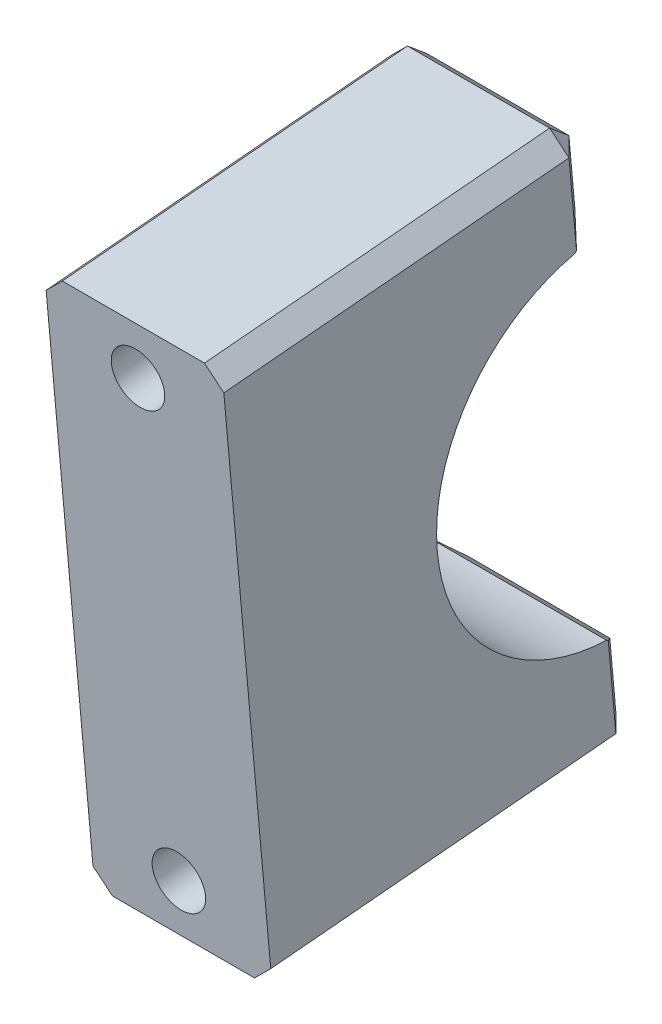
ISO-10303-21;
HEADER;
FILE_DESCRIPTION(('STEP AP214'),'2;1');
FILE_NAME('part.step','',(''),(''),'','','');
FILE_SCHEMA(('AUTOMOTIVE_DESIGN { 1 0 10303 214 1 1 1 1 }'));
ENDSEC;
DATA;
#1=APPLICATION_CONTEXT('core data for automotive mechanical design processes');
#2=APPLICATION_PROTOCOL_DEFINITION('international standard','automotive_design',2000,#1);
#3=PRODUCT_CONTEXT('',#1,'mechanical');
#4=PRODUCT('Part','Part','',(#3));
#5=PRODUCT_RELATED_PRODUCT_CATEGORY('part','',(#4));
#6=PRODUCT_DEFINITION_FORMATION('','',#4);
#7=PRODUCT_DEFINITION_CONTEXT('part definition',#1,'design');
#8=PRODUCT_DEFINITION('design','',#6,#7);
#9=PRODUCT_DEFINITION_SHAPE('','',#8);
#10=(LENGTH_UNIT() NAMED_UNIT(*) SI_UNIT(.MILLI.,.METRE.));
#11=(NAMED_UNIT(*) PLANE_ANGLE_UNIT() SI_UNIT($,.RADIAN.));
#12=(NAMED_UNIT(*) SI_UNIT($,.STERADIAN.) SOLID_ANGLE_UNIT());
#13=UNCERTAINTY_MEASURE_WITH_UNIT(LENGTH_MEASURE(1.E-05),#10,'distance_accuracy_value','');
#14=(GEOMETRIC_REPRESENTATION_CONTEXT(3) GLOBAL_UNCERTAINTY_ASSIGNED_CONTEXT((#13)) GLOBAL_UNIT_ASSIGNED_CONTEXT((#10,
#11,#12)) REPRESENTATION_CONTEXT('',''));
#15=CARTESIAN_POINT('',(0.,0.,0.));
#16=DIRECTION('',(0.,0.,1.));
#17=DIRECTION('',(1.,0.,0.));
#18=AXIS2_PLACEMENT_3D('',#15,#16,#17);
#19=CARTESIAN_POINT('',(0.,12.6267527219775,-140.67598203209));
#20=DIRECTION('',(0.,0.0893983070615619,-0.995995955159722));
#21=DIRECTION('',(0.,0.995995955159722,0.0893983070615619));
#22=AXIS2_PLACEMENT_3D('',#19,#20,#21);
#23=PLANE('',#22);
#24=DIRECTION('',(0.,-0.995995955159722,-0.0893983070615619));
#25=VECTOR('',#24,1.);
#26=CARTESIAN_POINT('',(-143.608320490601,136.633762355384,-129.545397949331));
#27=LINE('',#26,#25);
#28=CARTESIAN_POINT('',(-143.608320490601,141.367496523186,-129.120508853659));
#29=VERTEX_POINT('',#28);
#30=CARTESIAN_POINT('',(-143.608320490601,137.629758310544,-129.455999642269));
#31=VERTEX_POINT('',#30);
#32=EDGE_CURVE('E159',#29,#31,#27,.T.);
#33=ORIENTED_EDGE('',*,*,#32,.T.);
#34=DIRECTION('',(-1.,0.,0.));
#35=VECTOR('',#34,1.);
#36=CARTESIAN_POINT('',(-152.608320490601,137.629758310544,-129.455999642269));
#37=LINE('',#36,#35);
#38=CARTESIAN_POINT('',(-151.608320490601,137.629758310544,-129.455999642269));
#39=VERTEX_POINT('',#38);
#40=EDGE_CURVE('E197',#31,#39,#37,.T.);
#41=ORIENTED_EDGE('',*,*,#40,.T.);
#42=DIRECTION('',(0.,0.995995955159722,0.0893983070615619));
#43=VECTOR('',#42,1.);
#44=CARTESIAN_POINT('',(-151.608320490601,142.363492478346,-129.031110546597));
#45=LINE('',#44,#43);
#46=CARTESIAN_POINT('',(-151.608320490601,141.367496523186,-129.120508853659));
#47=VERTEX_POINT('',#46);
#48=EDGE_CURVE('E195',#39,#47,#45,.T.);
#49=ORIENTED_EDGE('',*,*,#48,.T.);
#50=DIRECTION('',(1.,0.,0.));
#51=VECTOR('',#50,1.);
#52=CARTESIAN_POINT('',(-142.608320490601,141.367496523186,-129.120508853659));
#53=LINE('',#52,#51);
#54=EDGE_CURVE('E193',#47,#29,#53,.T.);
#55=ORIENTED_EDGE('',*,*,#54,.T.);
#56=EDGE_LOOP('',(#33,#41,#49,#55));
#57=FACE_BOUND('',#56,.T.);
#58=CARTESIAN_POINT('',(-147.608320490601,139.500004107275,-129.288130679398));
#59=DIRECTION('',(0.,0.0893983070615618,-0.995995955159722));
#60=DIRECTION('',(0.,0.995995955159722,0.0893983070615618));
#61=AXIS2_PLACEMENT_3D('',#58,#59,#60);
#62=CIRCLE('',#61,1.4999999999669);
#63=CARTESIAN_POINT('',(-147.608320490601,138.006010174568,-129.422228139987));
#64=VERTEX_POINT('',#63);
#65=EDGE_CURVE('E327',#64,#64,#62,.T.);
#66=ORIENTED_EDGE('',*,*,#65,.F.);
#67=EDGE_LOOP('',(#66));
#68=FACE_BOUND('',#67,.T.);
#69=ADVANCED_FACE('F37',(#57,#68),#23,.T.);
#70=DIRECTION('',(0.,0.995995955159722,0.0893983070615619));
#71=VECTOR('',#70,1.);
#72=CARTESIAN_POINT('',(-151.608320490601,116.719350013722,-131.332869816308));
#73=LINE('',#72,#71);
#74=CARTESIAN_POINT('',(-151.608320490601,111.985615845974,-131.757758911975));
#75=VERTEX_POINT('',#74);
#76=CARTESIAN_POINT('',(-151.608320490601,115.723354058562,-131.422268123369));
#77=VERTEX_POINT('',#76);
#78=EDGE_CURVE('E215',#75,#77,#73,.T.);
#79=ORIENTED_EDGE('',*,*,#78,.T.);
#80=DIRECTION('',(1.,0.,0.));
#81=VECTOR('',#80,1.);
#82=CARTESIAN_POINT('',(-142.608320490601,115.723354058562,-131.422268123369));
#83=LINE('',#82,#81);
#84=CARTESIAN_POINT('',(-143.608320490601,115.723354058562,-131.422268123369));
#85=VERTEX_POINT('',#84);
#86=EDGE_CURVE('E217',#77,#85,#83,.T.);
#87=ORIENTED_EDGE('',*,*,#86,.T.);
#88=DIRECTION('',(0.,-0.995995955159722,-0.0893983070615619));
#89=VECTOR('',#88,1.);
#90=CARTESIAN_POINT('',(-143.608320490601,110.989619890814,-131.847157219036));
#91=LINE('',#90,#89);
#92=CARTESIAN_POINT('',(-143.608320490601,111.985615845974,-131.757758911975));
#93=VERTEX_POINT('',#92);
#94=EDGE_CURVE('E213',#85,#93,#91,.T.);
#95=ORIENTED_EDGE('',*,*,#94,.T.);
#96=DIRECTION('',(-1.,0.,0.));
#97=VECTOR('',#96,1.);
#98=CARTESIAN_POINT('',(-152.608320490601,111.985615845974,-131.757758911975));
#99=LINE('',#98,#97);
#100=EDGE_CURVE('E211',#93,#75,#99,.T.);
#101=ORIENTED_EDGE('',*,*,#100,.T.);
#102=EDGE_LOOP('',(#79,#87,#95,#101));
#103=FACE_BOUND('',#102,.T.);
#104=CARTESIAN_POINT('',(-147.608320490601,113.853108261885,-131.590137086236));
#105=DIRECTION('',(0.,0.0893983070615618,-0.995995955159722));
#106=DIRECTION('',(0.,-0.995995955159722,-0.0893983070615618));
#107=AXIS2_PLACEMENT_3D('',#104,#105,#106);
#108=CIRCLE('',#107,1.49999999997482);
#109=CARTESIAN_POINT('',(-147.608320490601,112.359114329171,-131.724234546826));
#110=VERTEX_POINT('',#109);
#111=EDGE_CURVE('E629',#110,#110,#108,.T.);
#112=ORIENTED_EDGE('',*,*,#111,.F.);
#113=EDGE_LOOP('',(#112));
#114=FACE_BOUND('',#113,.T.);
#115=ADVANCED_FACE('F380',(#103,#114),#23,.T.);
#116=CARTESIAN_POINT('',(0.,10.7940874272155,-120.258064951316));
#117=DIRECTION('',(0.,0.0893983070615619,-0.995995955159722));
#118=DIRECTION('',(0.,0.995995955159722,0.0893983070615619));
#119=AXIS2_PLACEMENT_3D('',#116,#117,#118);
#120=PLANE('',#119);
#121=DIRECTION('',(-1.,0.,0.));
#122=VECTOR('',#121,1.);
#123=CARTESIAN_POINT('',(-152.608320490601,109.156954596052,-111.429240138262));
#124=LINE('',#123,#122);
#125=CARTESIAN_POINT('',(-143.608320490601,109.156954596052,-111.429240138262));
#126=VERTEX_POINT('',#125);
#127=CARTESIAN_POINT('',(-151.608320490601,109.156954596052,-111.429240138262));
#128=VERTEX_POINT('',#127);
#129=EDGE_CURVE('E325',#126,#128,#124,.T.);
#130=ORIENTED_EDGE('',*,*,#129,.F.);
#131=DIRECTION('',(-0.707106781186546,-0.704275493927814,-0.0632141491498279));
#132=VECTOR('',#131,1.);
#133=CARTESIAN_POINT('',(-143.608320490601,109.156954596052,-111.429240138262));
#134=LINE('',#133,#132);
#135=CARTESIAN_POINT('',(-142.608320490601,110.152950551212,-111.339841831201));
#136=VERTEX_POINT('',#135);
#137=EDGE_CURVE('E232',#126,#136,#134,.F.);
#138=ORIENTED_EDGE('',*,*,#137,.T.);
#139=DIRECTION('',(0.,-0.995995955159722,-0.0893983070615619));
#140=VECTOR('',#139,1.);
#141=CARTESIAN_POINT('',(-142.608320490601,109.156954596052,-111.429240138262));
#142=LINE('',#141,#140);
#143=CARTESIAN_POINT('',(-142.608320490601,139.534831228424,-108.702591772885));
#144=VERTEX_POINT('',#143);
#145=EDGE_CURVE('E323',#144,#136,#142,.T.);
#146=ORIENTED_EDGE('',*,*,#145,.F.);
#147=DIRECTION('',(0.707106781186546,-0.704275493927814,-0.0632141491498279));
#148=VECTOR('',#147,1.);
#149=CARTESIAN_POINT('',(-142.608320490601,139.534831228424,-108.702591772885));
#150=LINE('',#149,#148);
#151=CARTESIAN_POINT('',(-143.608320490601,140.530827183584,-108.613193465823));
#152=VERTEX_POINT('',#151);
#153=EDGE_CURVE('E226',#144,#152,#150,.F.);
#154=ORIENTED_EDGE('',*,*,#153,.T.);
#155=DIRECTION('',(1.,0.,0.));
#156=VECTOR('',#155,1.);
#157=CARTESIAN_POINT('',(-152.608320490601,140.530827183584,-108.613193465823));
#158=LINE('',#157,#156);
#159=CARTESIAN_POINT('',(-151.608320490601,140.530827183584,-108.613193465823));
#160=VERTEX_POINT('',#159);
#161=EDGE_CURVE('E176',#160,#152,#158,.T.);
#162=ORIENTED_EDGE('',*,*,#161,.F.);
#163=DIRECTION('',(0.707106781186546,0.704275493927814,0.0632141491498279));
#164=VECTOR('',#163,1.);
#165=CARTESIAN_POINT('',(-151.608320490601,140.530827183584,-108.613193465823));
#166=LINE('',#165,#164);
#167=CARTESIAN_POINT('',(-152.608320490601,139.534831228424,-108.702591772885));
#168=VERTEX_POINT('',#167);
#169=EDGE_CURVE('E228',#160,#168,#166,.F.);
#170=ORIENTED_EDGE('',*,*,#169,.T.);
#171=DIRECTION('',(0.,0.995995955159722,0.0893983070615615));
#172=VECTOR('',#171,1.);
#173=CARTESIAN_POINT('',(-152.608320490601,109.156954596052,-111.429240138262));
#174=LINE('',#173,#172);
#175=CARTESIAN_POINT('',(-152.608320490601,110.152950551212,-111.339841831201));
#176=VERTEX_POINT('',#175);
#177=EDGE_CURVE('E180',#176,#168,#174,.T.);
#178=ORIENTED_EDGE('',*,*,#177,.F.);
#179=DIRECTION('',(-0.707106781186546,0.704275493927814,0.0632141491498279));
#180=VECTOR('',#179,1.);
#181=CARTESIAN_POINT('',(-152.608320490601,110.152950551212,-111.339841831201));
#182=LINE('',#181,#180);
#183=EDGE_CURVE('E230',#176,#128,#182,.F.);
#184=ORIENTED_EDGE('',*,*,#183,.T.);
#185=EDGE_LOOP('',(#130,#138,#146,#154,#162,#170,#178,#184));
#186=FACE_BOUND('',#185,.T.);
#187=CARTESIAN_POINT('',(-147.608320490601,137.667338812513,-108.870213598624));
#188=DIRECTION('',(0.,0.0893983070615618,-0.995995955159722));
#189=DIRECTION('',(0.,0.995995955159722,0.0893983070615618));
#190=AXIS2_PLACEMENT_3D('',#187,#188,#189);
#191=CIRCLE('',#190,1.4999999999669);
#192=CARTESIAN_POINT('',(-147.608320490601,136.173344879806,-109.004311059213));
#193=VERTEX_POINT('',#192);
#194=EDGE_CURVE('E331',#193,#193,#191,.T.);
#195=ORIENTED_EDGE('',*,*,#194,.T.);
#196=EDGE_LOOP('',(#195));
#197=FACE_BOUND('',#196,.T.);
#198=CARTESIAN_POINT('',(-147.608320490601,112.020442967123,-111.172220005461));
#199=DIRECTION('',(0.,0.0893983070615618,-0.995995955159722));
#200=DIRECTION('',(0.,-0.995995955159722,-0.0893983070615618));
#201=AXIS2_PLACEMENT_3D('',#198,#199,#200);
#202=CIRCLE('',#201,1.49999999997482);
#203=CARTESIAN_POINT('',(-147.608320490601,110.526449034409,-111.306317466052));
#204=VERTEX_POINT('',#203);
#205=EDGE_CURVE('E170',#204,#204,#202,.T.);
#206=ORIENTED_EDGE('',*,*,#205,.T.);
#207=EDGE_LOOP('',(#206));
#208=FACE_BOUND('',#207,.T.);
#209=ADVANCED_FACE('F321',(#186,#197,#208),#120,.F.);
#210=CARTESIAN_POINT('',(-142.608320490601,110.989619890814,-131.847157219036));
#211=DIRECTION('',(-1.,0.,0.));
#212=DIRECTION('',(0.,0.,1.));
#213=AXIS2_PLACEMENT_3D('',#210,#211,#212);
#214=PLANE('',#213);
#215=DIRECTION('',(0.,0.995995955159722,0.0893983070615619));
#216=VECTOR('',#215,1.);
#217=CARTESIAN_POINT('',(-142.608320490601,116.62995170666,-130.336873861148));
#218=LINE('',#217,#216);
#219=CARTESIAN_POINT('',(-142.608320490601,111.896217538913,-130.761762956815));
#220=VERTEX_POINT('',#219);
#221=CARTESIAN_POINT('',(-142.608320490601,116.62995170666,-130.336873861148));
#222=VERTEX_POINT('',#221);
#223=EDGE_CURVE('E155',#220,#222,#218,.T.);
#224=ORIENTED_EDGE('',*,*,#223,.T.);
#225=DIRECTION('',(0.,0.641061344777986,0.767489643077638));
#226=VECTOR('',#225,1.);
#227=CARTESIAN_POINT('',(-142.608320490601,116.706755589763,-130.244922934283));
#228=LINE('',#227,#226);
#229=CARTESIAN_POINT('',(-142.608320490601,116.706755589763,-130.244922934283));
#230=VERTEX_POINT('',#229);
#231=EDGE_CURVE('E150',#222,#230,#228,.T.);
#232=ORIENTED_EDGE('',*,*,#231,.T.);
#233=CARTESIAN_POINT('',(-142.608320490601,126.697575502733,-130.673312320594));
#234=DIRECTION('',(-1.,0.,0.));
#235=DIRECTION('',(0.,0.,1.));
#236=AXIS2_PLACEMENT_3D('',#233,#234,#235);
#237=CIRCLE('',#236,9.99999999998496);
#238=CARTESIAN_POINT('',(-142.608320490601,136.452413121458,-128.472598111069));
#239=VERTEX_POINT('',#238);
#240=EDGE_CURVE('E153',#230,#239,#237,.T.);
#241=ORIENTED_EDGE('',*,*,#240,.T.);
#242=DIRECTION('',(0.,-0.767489643077638,0.641061344777986));
#243=VECTOR('',#242,1.);
#244=CARTESIAN_POINT('',(-142.608320490601,136.452413121458,-128.472598111069));
#245=LINE('',#244,#243);
#246=CARTESIAN_POINT('',(-142.608320490601,136.544364048323,-128.549401994171));
#247=VERTEX_POINT('',#246);
#248=EDGE_CURVE('E187',#239,#247,#245,.F.);
#249=ORIENTED_EDGE('',*,*,#248,.T.);
#250=DIRECTION('',(0.,0.995995955159722,0.0893983070615619));
#251=VECTOR('',#250,1.);
#252=CARTESIAN_POINT('',(-142.608320490601,142.274094171284,-128.035114591438));
#253=LINE('',#252,#251);
#254=CARTESIAN_POINT('',(-142.608320490601,141.278098216124,-128.124512898499));
#255=VERTEX_POINT('',#254);
#256=EDGE_CURVE('E185',#247,#255,#253,.T.);
#257=ORIENTED_EDGE('',*,*,#256,.T.);
#258=DIRECTION('',(0.,-0.0893983070615619,0.995995955159722));
#259=VECTOR('',#258,1.);
#260=CARTESIAN_POINT('',(-142.608320490601,141.367496523186,-129.120508853659));
#261=LINE('',#260,#259);
#262=EDGE_CURVE('E178',#255,#144,#261,.T.);
#263=ORIENTED_EDGE('',*,*,#262,.T.);
#264=ORIENTED_EDGE('',*,*,#145,.T.);
#265=DIRECTION('',(0.,0.0893983070615619,-0.995995955159722));
#266=VECTOR('',#265,1.);
#267=CARTESIAN_POINT('',(-142.608320490601,111.985615845974,-131.757758911975));
#268=LINE('',#267,#266);
#269=EDGE_CURVE('E189',#136,#220,#268,.T.);
#270=ORIENTED_EDGE('',*,*,#269,.T.);
#271=EDGE_LOOP('',(#224,#232,#241,#249,#257,#263,#264,#270));
#272=FACE_BOUND('',#271,.T.);
#273=ADVANCED_FACE('F152',(#272),#214,.F.);
#274=CARTESIAN_POINT('',(-152.608320490601,110.989619890814,-131.847157219036));
#275=DIRECTION('',(0.,0.995995955159722,0.0893983070615618));
#276=DIRECTION('',(0.,-0.0893983070615619,0.995995955159722));
#277=AXIS2_PLACEMENT_3D('',#274,#275,#276);
#278=PLANE('',#277);
#279=DIRECTION('',(1.,0.,0.));
#280=VECTOR('',#279,1.);
#281=CARTESIAN_POINT('',(-142.608320490601,110.900221583753,-130.851161263877));
#282=LINE('',#281,#280);
#283=CARTESIAN_POINT('',(-151.608320490601,110.900221583753,-130.851161263877));
#284=VERTEX_POINT('',#283);
#285=CARTESIAN_POINT('',(-143.608320490601,110.900221583753,-130.851161263877));
#286=VERTEX_POINT('',#285);
#287=EDGE_CURVE('E222',#284,#286,#282,.T.);
#288=ORIENTED_EDGE('',*,*,#287,.T.);
#289=DIRECTION('',(0.,-0.0893983070615619,0.995995955159722));
#290=VECTOR('',#289,1.);
#291=CARTESIAN_POINT('',(-143.608320490601,110.989619890814,-131.847157219036));
#292=LINE('',#291,#290);
#293=EDGE_CURVE('E224',#286,#126,#292,.T.);
#294=ORIENTED_EDGE('',*,*,#293,.T.);
#295=ORIENTED_EDGE('',*,*,#129,.T.);
#296=DIRECTION('',(0.,0.0893983070615619,-0.995995955159722));
#297=VECTOR('',#296,1.);
#298=CARTESIAN_POINT('',(-151.608320490601,110.989619890814,-131.847157219036));
#299=LINE('',#298,#297);
#300=EDGE_CURVE('E220',#128,#284,#299,.T.);
#301=ORIENTED_EDGE('',*,*,#300,.T.);
#302=EDGE_LOOP('',(#288,#294,#295,#301));
#303=FACE_BOUND('',#302,.T.);
#304=ADVANCED_FACE('F312',(#303),#278,.F.);
#305=CARTESIAN_POINT('',(-152.608320490601,110.989619890814,-131.847157219036));
#306=DIRECTION('',(1.,0.,0.));
#307=DIRECTION('',(0.,0.,-1.));
#308=AXIS2_PLACEMENT_3D('',#305,#306,#307);
#309=PLANE('',#308);
#310=CARTESIAN_POINT('',(-152.608320490601,126.697575502733,-130.673312320594));
#311=DIRECTION('',(1.,0.,0.));
#312=DIRECTION('',(0.,0.,-1.));
#313=AXIS2_PLACEMENT_3D('',#310,#311,#312);
#314=CIRCLE('',#313,9.99999999998496);
#315=CARTESIAN_POINT('',(-152.608320490601,136.452413121458,-128.472598111069));
#316=VERTEX_POINT('',#315);
#317=CARTESIAN_POINT('',(-152.608320490601,116.706755589763,-130.244922934283));
#318=VERTEX_POINT('',#317);
#319=EDGE_CURVE('E171',#316,#318,#314,.T.);
#320=ORIENTED_EDGE('',*,*,#319,.T.);
#321=DIRECTION('',(0.,-0.641061344777986,-0.767489643077638));
#322=VECTOR('',#321,1.);
#323=CARTESIAN_POINT('',(-152.608320490601,116.706755589763,-130.244922934283));
#324=LINE('',#323,#322);
#325=CARTESIAN_POINT('',(-152.608320490601,116.62995170666,-130.336873861148));
#326=VERTEX_POINT('',#325);
#327=EDGE_CURVE('E175',#318,#326,#324,.T.);
#328=ORIENTED_EDGE('',*,*,#327,.T.);
#329=DIRECTION('',(0.,-0.995995955159722,-0.0893983070615619));
#330=VECTOR('',#329,1.);
#331=CARTESIAN_POINT('',(-152.608320490601,110.900221583753,-130.851161263877));
#332=LINE('',#331,#330);
#333=CARTESIAN_POINT('',(-152.608320490601,111.896217538913,-130.761762956815));
#334=VERTEX_POINT('',#333);
#335=EDGE_CURVE('E208',#326,#334,#332,.T.);
#336=ORIENTED_EDGE('',*,*,#335,.T.);
#337=DIRECTION('',(0.,-0.0893983070615619,0.995995955159722));
#338=VECTOR('',#337,1.);
#339=CARTESIAN_POINT('',(-152.608320490601,111.985615845974,-131.757758911975));
#340=LINE('',#339,#338);
#341=EDGE_CURVE('E206',#334,#176,#340,.T.);
#342=ORIENTED_EDGE('',*,*,#341,.T.);
#343=ORIENTED_EDGE('',*,*,#177,.T.);
#344=DIRECTION('',(0.,0.0893983070615619,-0.995995955159722));
#345=VECTOR('',#344,1.);
#346=CARTESIAN_POINT('',(-152.608320490601,141.367496523186,-129.120508853659));
#347=LINE('',#346,#345);
#348=CARTESIAN_POINT('',(-152.608320490601,141.278098216124,-128.124512898499));
#349=VERTEX_POINT('',#348);
#350=EDGE_CURVE('E200',#168,#349,#347,.T.);
#351=ORIENTED_EDGE('',*,*,#350,.T.);
#352=DIRECTION('',(0.,-0.995995955159722,-0.0893983070615619));
#353=VECTOR('',#352,1.);
#354=CARTESIAN_POINT('',(-152.608320490601,136.544364048323,-128.549401994171));
#355=LINE('',#354,#353);
#356=CARTESIAN_POINT('',(-152.608320490601,136.544364048323,-128.549401994171));
#357=VERTEX_POINT('',#356);
#358=EDGE_CURVE('E202',#349,#357,#355,.T.);
#359=ORIENTED_EDGE('',*,*,#358,.T.);
#360=DIRECTION('',(0.,0.767489643077638,-0.641061344777986));
#361=VECTOR('',#360,1.);
#362=CARTESIAN_POINT('',(-152.608320490601,136.452413121458,-128.472598111069));
#363=LINE('',#362,#361);
#364=EDGE_CURVE('E204',#357,#316,#363,.F.);
#365=ORIENTED_EDGE('',*,*,#364,.T.);
#366=EDGE_LOOP('',(#320,#328,#336,#342,#343,#351,#359,#365));
#367=FACE_BOUND('',#366,.T.);
#368=ADVANCED_FACE('F298',(#367),#309,.F.);
#369=CARTESIAN_POINT('',(-152.608320490601,142.363492478346,-129.031110546597));
#370=DIRECTION('',(0.,-0.995995955159722,-0.0893983070615618));
#371=DIRECTION('',(0.,0.0893983070615619,-0.995995955159722));
#372=AXIS2_PLACEMENT_3D('',#369,#370,#371);
#373=PLANE('',#372);
#374=DIRECTION('',(-1.,0.,0.));
#375=VECTOR('',#374,1.);
#376=CARTESIAN_POINT('',(-152.608320490601,142.274094171284,-128.035114591438));
#377=LINE('',#376,#375);
#378=CARTESIAN_POINT('',(-143.608320490601,142.274094171284,-128.035114591438));
#379=VERTEX_POINT('',#378);
#380=CARTESIAN_POINT('',(-151.608320490601,142.274094171284,-128.035114591438));
#381=VERTEX_POINT('',#380);
#382=EDGE_CURVE('E47',#379,#381,#377,.T.);
#383=ORIENTED_EDGE('',*,*,#382,.T.);
#384=DIRECTION('',(0.,-0.0893983070615619,0.995995955159722));
#385=VECTOR('',#384,1.);
#386=CARTESIAN_POINT('',(-151.608320490601,142.363492478346,-129.031110546597));
#387=LINE('',#386,#385);
#388=EDGE_CURVE('E11',#381,#160,#387,.T.);
#389=ORIENTED_EDGE('',*,*,#388,.T.);
#390=ORIENTED_EDGE('',*,*,#161,.T.);
#391=DIRECTION('',(0.,0.0893983070615619,-0.995995955159722));
#392=VECTOR('',#391,1.);
#393=CARTESIAN_POINT('',(-143.608320490601,142.363492478346,-129.031110546597));
#394=LINE('',#393,#392);
#395=EDGE_CURVE('E58',#152,#379,#394,.T.);
#396=ORIENTED_EDGE('',*,*,#395,.T.);
#397=EDGE_LOOP('',(#383,#389,#390,#396));
#398=FACE_BOUND('',#397,.T.);
#399=ADVANCED_FACE('F366',(#398),#373,.F.);
#400=CARTESIAN_POINT('',(-147.608320490601,139.500004107275,-129.288130679398));
#401=DIRECTION('',(0.,-0.0893983070615618,0.995995955159722));
#402=DIRECTION('',(0.,-0.995995955159722,-0.0893983070615619));
#403=AXIS2_PLACEMENT_3D('',#400,#401,#402);
#404=CYLINDRICAL_SURFACE('',#403,1.4999999999669);
#405=CARTESIAN_POINT('',(-147.608320490601,138.006010174568,-129.422228139987));
#406=CARTESIAN_POINT('',(-147.608320490601,137.986919911081,-129.209541503729));
#407=CARTESIAN_POINT('',(-147.608320490601,137.967829647594,-128.996854867471));
#408=CARTESIAN_POINT('',(-147.608320490601,137.92964912062,-128.571481594955));
#409=CARTESIAN_POINT('',(-147.608320490601,137.910558857133,-128.358794958697));
#410=CARTESIAN_POINT('',(-147.608320490601,137.872378330159,-127.933421686181));
#411=CARTESIAN_POINT('',(-147.608320490601,137.853288066671,-127.720735049923));
#412=CARTESIAN_POINT('',(-147.608320490601,137.815107539697,-127.295361777407));
#413=CARTESIAN_POINT('',(-147.608320490601,137.79601727621,-127.082675141149));
#414=CARTESIAN_POINT('',(-147.608320490601,137.757836749236,-126.657301868633));
#415=CARTESIAN_POINT('',(-147.608320490601,137.738746485749,-126.444615232375));
#416=CARTESIAN_POINT('',(-147.608320490601,137.700565958775,-126.019241959858));
#417=CARTESIAN_POINT('',(-147.608320490601,137.681475695288,-125.8065553236));
#418=CARTESIAN_POINT('',(-147.608320490601,137.643295168313,-125.381182051084));
#419=CARTESIAN_POINT('',(-147.608320490601,137.624204904826,-125.168495414826));
#420=CARTESIAN_POINT('',(-147.608320490601,137.586024377852,-124.74312214231));
#421=CARTESIAN_POINT('',(-147.608320490601,137.566934114365,-124.530435506052));
#422=CARTESIAN_POINT('',(-147.608320490601,137.528753587391,-124.105062233536));
#423=CARTESIAN_POINT('',(-147.608320490601,137.509663323904,-123.892375597278));
#424=CARTESIAN_POINT('',(-147.608320490601,137.471482796929,-123.467002324762));
#425=CARTESIAN_POINT('',(-147.608320490601,137.452392533442,-123.254315688504));
#426=CARTESIAN_POINT('',(-147.608320490601,137.414212006468,-122.828942415987));
#427=CARTESIAN_POINT('',(-147.608320490601,137.395121742981,-122.616255779729));
#428=CARTESIAN_POINT('',(-147.608320490601,137.356941216007,-122.190882507213));
#429=CARTESIAN_POINT('',(-147.608320490601,137.33785095252,-121.978195870955));
#430=CARTESIAN_POINT('',(-147.608320490601,137.299670425545,-121.552822598439));
#431=CARTESIAN_POINT('',(-147.608320490601,137.280580162058,-121.340135962181));
#432=CARTESIAN_POINT('',(-147.608320490601,137.242399635084,-120.914762689665));
#433=CARTESIAN_POINT('',(-147.608320490601,137.223309371597,-120.702076053407));
#434=CARTESIAN_POINT('',(-147.608320490601,137.185128844623,-120.276702780891));
#435=CARTESIAN_POINT('',(-147.608320490601,137.166038581136,-120.064016144633));
#436=CARTESIAN_POINT('',(-147.608320490601,137.127858054162,-119.638642872116));
#437=CARTESIAN_POINT('',(-147.608320490601,137.108767790674,-119.425956235858));
#438=CARTESIAN_POINT('',(-147.608320490601,137.0705872637,-119.000582963342));
#439=CARTESIAN_POINT('',(-147.608320490601,137.051497000213,-118.787896327084));
#440=CARTESIAN_POINT('',(-147.608320490601,137.013316473239,-118.362523054568));
#441=CARTESIAN_POINT('',(-147.608320490601,136.994226209752,-118.14983641831));
#442=CARTESIAN_POINT('',(-147.608320490601,136.956045682778,-117.724463145794));
#443=CARTESIAN_POINT('',(-147.608320490601,136.93695541929,-117.511776509536));
#444=CARTESIAN_POINT('',(-147.608320490601,136.898774892316,-117.08640323702));
#445=CARTESIAN_POINT('',(-147.608320490601,136.879684628829,-116.873716600762));
#446=CARTESIAN_POINT('',(-147.608320490601,136.841504101855,-116.448343328245));
#447=CARTESIAN_POINT('',(-147.608320490601,136.822413838368,-116.235656691987));
#448=CARTESIAN_POINT('',(-147.608320490601,136.784233311394,-115.810283419471));
#449=CARTESIAN_POINT('',(-147.608320490601,136.765143047907,-115.597596783213));
#450=CARTESIAN_POINT('',(-147.608320490601,136.726962520932,-115.172223510697));
#451=CARTESIAN_POINT('',(-147.608320490601,136.707872257445,-114.959536874439));
#452=CARTESIAN_POINT('',(-147.608320490601,136.669691730471,-114.534163601923));
#453=CARTESIAN_POINT('',(-147.608320490601,136.650601466984,-114.321476965665));
#454=CARTESIAN_POINT('',(-147.608320490601,136.61242094001,-113.896103693149));
#455=CARTESIAN_POINT('',(-147.608320490601,136.593330676523,-113.683417056891));
#456=CARTESIAN_POINT('',(-147.608320490601,136.555150149548,-113.258043784374));
#457=CARTESIAN_POINT('',(-147.608320490601,136.536059886061,-113.045357148116));
#458=CARTESIAN_POINT('',(-147.608320490601,136.497879359087,-112.6199838756));
#459=CARTESIAN_POINT('',(-147.608320490601,136.4787890956,-112.407297239342));
#460=CARTESIAN_POINT('',(-147.608320490601,136.440608568626,-111.981923966826));
#461=CARTESIAN_POINT('',(-147.608320490601,136.421518305139,-111.769237330568));
#462=CARTESIAN_POINT('',(-147.608320490601,136.383337778164,-111.343864058052));
#463=CARTESIAN_POINT('',(-147.608320490601,136.364247514677,-111.131177421794));
#464=CARTESIAN_POINT('',(-147.608320490601,136.326066987703,-110.705804149278));
#465=CARTESIAN_POINT('',(-147.608320490601,136.306976724216,-110.49311751302));
#466=CARTESIAN_POINT('',(-147.608320490601,136.268796197242,-110.067744240504));
#467=CARTESIAN_POINT('',(-147.608320490601,136.249705933755,-109.855057604245));
#468=CARTESIAN_POINT('',(-147.608320490601,136.211525406781,-109.429684331729));
#469=CARTESIAN_POINT('',(-147.608320490601,136.192435143293,-109.216997695471));
#470=CARTESIAN_POINT('',(-147.608320490601,136.173344879806,-109.004311059213));
#471=B_SPLINE_CURVE_WITH_KNOTS('',3,(#405,#406,#407,#408,#409,#410,#411,#412,#413,#414,#415,
#416,#417,#418,#419,#420,#421,#422,#423,#424,#425,#426,#427,#428,#429,#430,#431,#432,#433,#434,
#435,#436,#437,#438,#439,#440,#441,#442,#443,#444,#445,#446,#447,#448,#449,#450,#451,#452,#453,
#454,#455,#456,#457,#458,#459,#460,#461,#462,#463,#464,#465,#466,#467,#468,#469,#470),
.UNSPECIFIED.,.F.,.F.,(4,2,2,2,2,2,2,2,2,2,2,2,2,2,2,2,2,2,2,2,2,2,2,2,2,2,2,2,2,2,2,2,4),(0.,
0.640625000000021,1.28125000000002,1.92187500000001,2.5625,3.20312500000003,3.84375000000002,
4.48437500000002,5.12500000000002,5.76562500000002,6.40625000000003,7.04687500000002,
7.68750000000001,8.32812500000002,8.96875000000002,9.60937500000003,10.25,10.890625,11.53125,
12.171875,12.8125,13.453125,14.09375,14.734375,15.375,16.015625,16.65625,17.296875,17.9375,
18.578125,19.21875,19.859375,20.5),.UNSPECIFIED.);
#472=EDGE_CURVE('BSEAM368',#64,#193,#471,.T.);
#473=ORIENTED_EDGE('',*,*,#65,.T.);
#474=ORIENTED_EDGE('',*,*,#194,.F.);
#475=ORIENTED_EDGE('',*,*,#472,.T.);
#476=ORIENTED_EDGE('',*,*,#472,.F.);
#477=EDGE_LOOP('',(#473,#475,#474,#476));
#478=FACE_BOUND('',#477,.T.);
#479=ADVANCED_FACE('F368',(#478),#404,.F.);
#480=CARTESIAN_POINT('',(-147.608320490601,113.853108261885,-131.590137086236));
#481=DIRECTION('',(0.,-0.0893983070615618,0.995995955159722));
#482=DIRECTION('',(0.,-0.995995955159722,-0.0893983070615619));
#483=AXIS2_PLACEMENT_3D('',#480,#481,#482);
#484=CYLINDRICAL_SURFACE('',#483,1.49999999997482);
#485=CARTESIAN_POINT('',(-147.608320490601,112.359114329171,-131.724234546826));
#486=CARTESIAN_POINT('',(-147.608320490601,112.340024065684,-131.511547910568));
#487=CARTESIAN_POINT('',(-147.608320490601,112.320933802196,-131.29886127431));
#488=CARTESIAN_POINT('',(-147.608320490601,112.282753275222,-130.873488001794));
#489=CARTESIAN_POINT('',(-147.608320490601,112.263663011735,-130.660801365535));
#490=CARTESIAN_POINT('',(-147.608320490601,112.225482484761,-130.235428093019));
#491=CARTESIAN_POINT('',(-147.608320490601,112.206392221274,-130.022741456761));
#492=CARTESIAN_POINT('',(-147.608320490601,112.1682116943,-129.597368184245));
#493=CARTESIAN_POINT('',(-147.608320490601,112.149121430812,-129.384681547987));
#494=CARTESIAN_POINT('',(-147.608320490601,112.110940903838,-128.959308275471));
#495=CARTESIAN_POINT('',(-147.608320490601,112.091850640351,-128.746621639213));
#496=CARTESIAN_POINT('',(-147.608320490601,112.053670113377,-128.321248366697));
#497=CARTESIAN_POINT('',(-147.608320490601,112.03457984989,-128.108561730439));
#498=CARTESIAN_POINT('',(-147.608320490601,111.996399322916,-127.683188457923));
#499=CARTESIAN_POINT('',(-147.608320490601,111.977309059429,-127.470501821664));
#500=CARTESIAN_POINT('',(-147.608320490601,111.939128532454,-127.045128549148));
#501=CARTESIAN_POINT('',(-147.608320490601,111.920038268967,-126.83244191289));
#502=CARTESIAN_POINT('',(-147.608320490601,111.881857741993,-126.407068640374));
#503=CARTESIAN_POINT('',(-147.608320490601,111.862767478506,-126.194382004116));
#504=CARTESIAN_POINT('',(-147.608320490601,111.824586951532,-125.7690087316));
#505=CARTESIAN_POINT('',(-147.608320490601,111.805496688045,-125.556322095342));
#506=CARTESIAN_POINT('',(-147.608320490601,111.76731616107,-125.130948822826));
#507=CARTESIAN_POINT('',(-147.608320490601,111.748225897583,-124.918262186568));
#508=CARTESIAN_POINT('',(-147.608320490601,111.710045370609,-124.492888914052));
#509=CARTESIAN_POINT('',(-147.608320490601,111.690955107122,-124.280202277793));
#510=CARTESIAN_POINT('',(-147.608320490601,111.652774580148,-123.854829005277));
#511=CARTESIAN_POINT('',(-147.608320490601,111.633684316661,-123.642142369019));
#512=CARTESIAN_POINT('',(-147.608320490601,111.595503789686,-123.216769096503));
#513=CARTESIAN_POINT('',(-147.608320490601,111.576413526199,-123.004082460245));
#514=CARTESIAN_POINT('',(-147.608320490601,111.538232999225,-122.578709187729));
#515=CARTESIAN_POINT('',(-147.608320490601,111.519142735738,-122.366022551471));
#516=CARTESIAN_POINT('',(-147.608320490601,111.480962208764,-121.940649278955));
#517=CARTESIAN_POINT('',(-147.608320490601,111.461871945277,-121.727962642697));
#518=CARTESIAN_POINT('',(-147.608320490601,111.423691418303,-121.302589370181));
#519=CARTESIAN_POINT('',(-147.608320490601,111.404601154815,-121.089902733923));
#520=CARTESIAN_POINT('',(-147.608320490601,111.366420627841,-120.664529461406));
#521=CARTESIAN_POINT('',(-147.608320490601,111.347330364354,-120.451842825148));
#522=CARTESIAN_POINT('',(-147.608320490601,111.30914983738,-120.026469552632));
#523=CARTESIAN_POINT('',(-147.608320490601,111.290059573893,-119.813782916374));
#524=CARTESIAN_POINT('',(-147.608320490601,111.251879046919,-119.388409643858));
#525=CARTESIAN_POINT('',(-147.608320490601,111.232788783431,-119.1757230076));
#526=CARTESIAN_POINT('',(-147.608320490601,111.194608256457,-118.750349735084));
#527=CARTESIAN_POINT('',(-147.608320490601,111.17551799297,-118.537663098826));
#528=CARTESIAN_POINT('',(-147.608320490601,111.137337465996,-118.11228982631));
#529=CARTESIAN_POINT('',(-147.608320490601,111.118247202509,-117.899603190052));
#530=CARTESIAN_POINT('',(-147.608320490601,111.080066675535,-117.474229917535));
#531=CARTESIAN_POINT('',(-147.608320490601,111.060976412048,-117.261543281277));
#532=CARTESIAN_POINT('',(-147.608320490601,111.022795885073,-116.836170008761));
#533=CARTESIAN_POINT('',(-147.608320490601,111.003705621586,-116.623483372503));
#534=CARTESIAN_POINT('',(-147.608320490601,110.965525094612,-116.198110099987));
#535=CARTESIAN_POINT('',(-147.608320490601,110.946434831125,-115.985423463729));
#536=CARTESIAN_POINT('',(-147.608320490601,110.908254304151,-115.560050191213));
#537=CARTESIAN_POINT('',(-147.608320490601,110.889164040664,-115.347363554955));
#538=CARTESIAN_POINT('',(-147.608320490601,110.850983513689,-114.921990282439));
#539=CARTESIAN_POINT('',(-147.608320490601,110.831893250202,-114.709303646181));
#540=CARTESIAN_POINT('',(-147.608320490601,110.793712723228,-114.283930373664));
#541=CARTESIAN_POINT('',(-147.608320490601,110.774622459741,-114.071243737406));
#542=CARTESIAN_POINT('',(-147.608320490601,110.736441932767,-113.64587046489));
#543=CARTESIAN_POINT('',(-147.608320490601,110.71735166928,-113.433183828632));
#544=CARTESIAN_POINT('',(-147.608320490601,110.679171142305,-113.007810556116));
#545=CARTESIAN_POINT('',(-147.608320490601,110.660080878818,-112.795123919858));
#546=CARTESIAN_POINT('',(-147.608320490601,110.621900351844,-112.369750647342));
#547=CARTESIAN_POINT('',(-147.608320490601,110.602810088357,-112.157064011084));
#548=CARTESIAN_POINT('',(-147.608320490601,110.564629561383,-111.731690738568));
#549=CARTESIAN_POINT('',(-147.608320490601,110.545539297896,-111.51900410231));
#550=CARTESIAN_POINT('',(-147.608320490601,110.526449034409,-111.306317466052));
#551=B_SPLINE_CURVE_WITH_KNOTS('',3,(#485,#486,#487,#488,#489,#490,#491,#492,#493,#494,#495,
#496,#497,#498,#499,#500,#501,#502,#503,#504,#505,#506,#507,#508,#509,#510,#511,#512,#513,#514,
#515,#516,#517,#518,#519,#520,#521,#522,#523,#524,#525,#526,#527,#528,#529,#530,#531,#532,#533,
#534,#535,#536,#537,#538,#539,#540,#541,#542,#543,#544,#545,#546,#547,#548,#549,#550),
.UNSPECIFIED.,.F.,.F.,(4,2,2,2,2,2,2,2,2,2,2,2,2,2,2,2,2,2,2,2,2,2,2,2,2,2,2,2,2,2,2,2,4),(0.,
0.640624999999995,1.28124999999999,1.92187499999998,2.56249999999998,3.20312499999997,
3.84374999999999,4.48437499999999,5.12499999999998,5.76562499999998,6.40624999999997,
7.04687499999998,7.68749999999999,8.32812499999998,8.96874999999998,9.60937499999999,10.25,
10.890625,11.53125,12.171875,12.8125,13.453125,14.09375,14.734375,15.375,16.015625,16.65625,
17.296875,17.9375,18.578125,19.21875,19.859375,20.5),.UNSPECIFIED.);
#552=EDGE_CURVE('BSEAM374',#110,#204,#551,.T.);
#553=ORIENTED_EDGE('',*,*,#111,.T.);
#554=ORIENTED_EDGE('',*,*,#205,.F.);
#555=ORIENTED_EDGE('',*,*,#552,.T.);
#556=ORIENTED_EDGE('',*,*,#552,.F.);
#557=EDGE_LOOP('',(#553,#555,#554,#556));
#558=FACE_BOUND('',#557,.T.);
#559=ADVANCED_FACE('F374',(#558),#484,.F.);
#560=CARTESIAN_POINT('',(-152.608320490601,126.697575502733,-130.673312320594));
#561=DIRECTION('',(1.,0.,0.));
#562=DIRECTION('',(0.,0.,-1.));
#563=AXIS2_PLACEMENT_3D('',#560,#561,#562);
#564=CYLINDRICAL_SURFACE('',#563,9.99999999998496);
#565=ORIENTED_EDGE('',*,*,#319,.F.);
#566=DIRECTION('',(1.,0.,0.));
#567=VECTOR('',#566,1.);
#568=CARTESIAN_POINT('',(-152.608320490601,136.452413121458,-128.472598111069));
#569=LINE('',#568,#567);
#570=EDGE_CURVE('E169',#316,#239,#569,.T.);
#571=ORIENTED_EDGE('',*,*,#570,.T.);
#572=ORIENTED_EDGE('',*,*,#240,.F.);
#573=DIRECTION('',(1.,0.,0.));
#574=VECTOR('',#573,1.);
#575=CARTESIAN_POINT('',(-152.608320490601,116.706755589763,-130.244922934283));
#576=LINE('',#575,#574);
#577=EDGE_CURVE('E166',#230,#318,#576,.F.);
#578=ORIENTED_EDGE('',*,*,#577,.T.);
#579=EDGE_LOOP('',(#565,#571,#572,#578));
#580=FACE_BOUND('',#579,.T.);
#581=ADVANCED_FACE('F165',(#580),#564,.F.);
#582=CARTESIAN_POINT('',(-151.608320490601,142.363492478346,-129.031110546597));
#583=DIRECTION('',(0.707106781186549,-0.70427549392781,-0.0632141491498276));
#584=DIRECTION('',(0.,-0.0893983070615619,0.995995955159722));
#585=AXIS2_PLACEMENT_3D('',#582,#583,#584);
#586=PLANE('',#585);
#587=ORIENTED_EDGE('',*,*,#169,.F.);
#588=ORIENTED_EDGE('',*,*,#388,.F.);
#589=DIRECTION('',(-0.707106781186546,-0.704275493927814,-0.0632141491498267));
#590=VECTOR('',#589,1.);
#591=CARTESIAN_POINT('',(-152.108320490601,141.776096193704,-128.079813744968));
#592=LINE('',#591,#590);
#593=EDGE_CURVE('E253',#349,#381,#592,.F.);
#594=ORIENTED_EDGE('',*,*,#593,.F.);
#595=ORIENTED_EDGE('',*,*,#350,.F.);
#596=EDGE_LOOP('',(#587,#588,#594,#595));
#597=FACE_BOUND('',#596,.T.);
#598=ADVANCED_FACE('F338',(#597),#586,.F.);
#599=CARTESIAN_POINT('',(-142.608320490601,141.367496523186,-129.120508853659));
#600=DIRECTION('',(-0.707106781186549,-0.70427549392781,-0.0632141491498273));
#601=DIRECTION('',(0.,-0.0893983070615619,0.995995955159722));
#602=AXIS2_PLACEMENT_3D('',#599,#600,#601);
#603=PLANE('',#602);
#604=ORIENTED_EDGE('',*,*,#153,.F.);
#605=ORIENTED_EDGE('',*,*,#262,.F.);
#606=DIRECTION('',(-0.707106781186545,0.704275493927814,0.0632141491498268));
#607=VECTOR('',#606,1.);
#608=CARTESIAN_POINT('',(-143.108320490601,141.776096193704,-128.079813744968));
#609=LINE('',#608,#607);
#610=EDGE_CURVE('E250',#379,#255,#609,.F.);
#611=ORIENTED_EDGE('',*,*,#610,.F.);
#612=ORIENTED_EDGE('',*,*,#395,.F.);
#613=EDGE_LOOP('',(#604,#605,#611,#612));
#614=FACE_BOUND('',#613,.T.);
#615=ADVANCED_FACE('F364',(#614),#603,.F.);
#616=CARTESIAN_POINT('',(0.,141.367496523186,-129.120508853659));
#617=DIRECTION('',(0.,0.767489643077639,-0.641061344777985));
#618=DIRECTION('',(-1.,0.,0.));
#619=AXIS2_PLACEMENT_3D('',#616,#617,#618);
#620=PLANE('',#619);
#621=DIRECTION('',(0.,-0.641061344777985,-0.767489643077639));
#622=VECTOR('',#621,1.);
#623=CARTESIAN_POINT('',(-151.608320490601,141.367496523186,-129.120508853659));
#624=LINE('',#623,#622);
#625=EDGE_CURVE('E256',#381,#47,#624,.T.);
#626=ORIENTED_EDGE('',*,*,#625,.F.);
#627=ORIENTED_EDGE('',*,*,#382,.F.);
#628=DIRECTION('',(0.,0.641061344777985,0.767489643077639));
#629=VECTOR('',#628,1.);
#630=CARTESIAN_POINT('',(-143.608320490601,141.367496523186,-129.120508853659));
#631=LINE('',#630,#629);
#632=EDGE_CURVE('E247',#29,#379,#631,.T.);
#633=ORIENTED_EDGE('',*,*,#632,.F.);
#634=ORIENTED_EDGE('',*,*,#54,.F.);
#635=EDGE_LOOP('',(#626,#627,#633,#634));
#636=FACE_BOUND('',#635,.T.);
#637=ADVANCED_FACE('F424',(#636),#620,.T.);
#638=CARTESIAN_POINT('',(-151.608320490601,141.367496523186,-129.120508853659));
#639=DIRECTION('',(-0.577350269189628,0.626652669470331,-0.523424396176154));
#640=DIRECTION('',(-0.735445572174875,-0.677583803206932,0.));
#641=AXIS2_PLACEMENT_3D('',#638,#639,#640);
#642=PLANE('',#641);
#643=ORIENTED_EDGE('',*,*,#593,.T.);
#644=ORIENTED_EDGE('',*,*,#625,.T.);
#645=DIRECTION('',(-0.707106781186541,-0.0632141491498191,0.704275493927819));
#646=VECTOR('',#645,1.);
#647=CARTESIAN_POINT('',(-151.608320490601,141.367496523186,-129.120508853659));
#648=LINE('',#647,#646);
#649=EDGE_CURVE('E244',#349,#47,#648,.F.);
#650=ORIENTED_EDGE('',*,*,#649,.F.);
#651=EDGE_LOOP('',(#643,#644,#650));
#652=FACE_BOUND('',#651,.T.);
#653=ADVANCED_FACE('F343',(#652),#642,.T.);
#654=CARTESIAN_POINT('',(-143.608320490601,141.367496523186,-129.120508853659));
#655=DIRECTION('',(0.577350269189628,0.626652669470331,-0.523424396176154));
#656=DIRECTION('',(-0.735445572174875,0.677583803206932,0.));
#657=AXIS2_PLACEMENT_3D('',#654,#655,#656);
#658=PLANE('',#657);
#659=ORIENTED_EDGE('',*,*,#632,.T.);
#660=ORIENTED_EDGE('',*,*,#610,.T.);
#661=DIRECTION('',(-0.707106781186541,0.0632141491498191,-0.704275493927819));
#662=VECTOR('',#661,1.);
#663=CARTESIAN_POINT('',(-143.608320490601,141.367496523186,-129.120508853659));
#664=LINE('',#663,#662);
#665=EDGE_CURVE('E241',#29,#255,#664,.F.);
#666=ORIENTED_EDGE('',*,*,#665,.F.);
#667=EDGE_LOOP('',(#659,#660,#666));
#668=FACE_BOUND('',#667,.T.);
#669=ADVANCED_FACE('F360',(#668),#658,.T.);
#670=CARTESIAN_POINT('',(-151.608320490601,12.6267527219775,-140.67598203209));
#671=DIRECTION('',(-0.707106781186554,0.0632141491498271,-0.704275493927806));
#672=DIRECTION('',(0.,-0.995995955159722,-0.0893983070615619));
#673=AXIS2_PLACEMENT_3D('',#670,#671,#672);
#674=PLANE('',#673);
#675=ORIENTED_EDGE('',*,*,#649,.T.);
#676=ORIENTED_EDGE('',*,*,#48,.F.);
#677=DIRECTION('',(0.57735026918962,0.626652669470336,-0.523424396176158));
#678=VECTOR('',#677,1.);
#679=CARTESIAN_POINT('',(-193.443498950578,92.2220956510812,-91.5283252426872));
#680=LINE('',#679,#678);
#681=EDGE_CURVE('E239',#357,#39,#680,.T.);
#682=ORIENTED_EDGE('',*,*,#681,.F.);
#683=ORIENTED_EDGE('',*,*,#358,.F.);
#684=EDGE_LOOP('',(#675,#676,#682,#683));
#685=FACE_BOUND('',#684,.T.);
#686=ADVANCED_FACE('F347',(#685),#674,.T.);
#687=CARTESIAN_POINT('',(-143.608320490601,12.6267527219775,-140.67598203209));
#688=DIRECTION('',(0.707106781186554,0.0632141491498271,-0.704275493927806));
#689=DIRECTION('',(0.,0.995995955159722,0.0893983070615619));
#690=AXIS2_PLACEMENT_3D('',#687,#688,#689);
#691=PLANE('',#690);
#692=ORIENTED_EDGE('',*,*,#665,.T.);
#693=ORIENTED_EDGE('',*,*,#256,.F.);
#694=DIRECTION('',(0.57735026918962,-0.626652669470336,0.523424396176158));
#695=VECTOR('',#694,1.);
#696=CARTESIAN_POINT('',(-101.773142030625,92.2220956510811,-91.5283252426872));
#697=LINE('',#696,#695);
#698=EDGE_CURVE('E236',#31,#247,#697,.T.);
#699=ORIENTED_EDGE('',*,*,#698,.F.);
#700=ORIENTED_EDGE('',*,*,#32,.F.);
#701=EDGE_LOOP('',(#692,#693,#699,#700));
#702=FACE_BOUND('',#701,.T.);
#703=ADVANCED_FACE('F356',(#702),#691,.T.);
#704=CARTESIAN_POINT('',(-152.608320490601,136.452413121458,-128.472598111069));
#705=DIRECTION('',(0.,0.641061344777986,0.767489643077638));
#706=DIRECTION('',(1.,0.,0.));
#707=AXIS2_PLACEMENT_3D('',#704,#705,#706);
#708=PLANE('',#707);
#709=ORIENTED_EDGE('',*,*,#681,.T.);
#710=ORIENTED_EDGE('',*,*,#40,.F.);
#711=ORIENTED_EDGE('',*,*,#698,.T.);
#712=ORIENTED_EDGE('',*,*,#248,.F.);
#713=ORIENTED_EDGE('',*,*,#570,.F.);
#714=ORIENTED_EDGE('',*,*,#364,.F.);
#715=EDGE_LOOP('',(#709,#710,#711,#712,#713,#714));
#716=FACE_BOUND('',#715,.T.);
#717=ADVANCED_FACE('F351',(#716),#708,.F.);
#718=CARTESIAN_POINT('',(-143.608320490601,110.989619890814,-131.847157219036));
#719=DIRECTION('',(-0.707106781186549,0.70427549392781,0.0632141491498276));
#720=DIRECTION('',(0.,-0.0893983070615619,0.995995955159722));
#721=AXIS2_PLACEMENT_3D('',#718,#719,#720);
#722=PLANE('',#721);
#723=ORIENTED_EDGE('',*,*,#137,.F.);
#724=ORIENTED_EDGE('',*,*,#293,.F.);
#725=DIRECTION('',(0.707106781186546,0.704275493927814,0.0632141491498271));
#726=VECTOR('',#725,1.);
#727=CARTESIAN_POINT('',(-143.108320490601,111.398219561333,-130.806462110346));
#728=LINE('',#727,#726);
#729=EDGE_CURVE('E274',#220,#286,#728,.F.);
#730=ORIENTED_EDGE('',*,*,#729,.F.);
#731=ORIENTED_EDGE('',*,*,#269,.F.);
#732=EDGE_LOOP('',(#723,#724,#730,#731));
#733=FACE_BOUND('',#732,.T.);
#734=ADVANCED_FACE('F40',(#733),#722,.F.);
#735=CARTESIAN_POINT('',(-152.608320490601,111.985615845974,-131.757758911975));
#736=DIRECTION('',(0.707106781186549,0.70427549392781,0.0632141491498273));
#737=DIRECTION('',(0.,-0.0893983070615619,0.995995955159722));
#738=AXIS2_PLACEMENT_3D('',#735,#736,#737);
#739=PLANE('',#738);
#740=ORIENTED_EDGE('',*,*,#183,.F.);
#741=ORIENTED_EDGE('',*,*,#341,.F.);
#742=DIRECTION('',(0.707106781186545,-0.704275493927814,-0.0632141491498268));
#743=VECTOR('',#742,1.);
#744=CARTESIAN_POINT('',(-152.608320490601,111.896217538913,-130.761762956815));
#745=LINE('',#744,#743);
#746=EDGE_CURVE('E272',#284,#334,#745,.F.);
#747=ORIENTED_EDGE('',*,*,#746,.F.);
#748=ORIENTED_EDGE('',*,*,#300,.F.);
#749=EDGE_LOOP('',(#740,#741,#747,#748));
#750=FACE_BOUND('',#749,.T.);
#751=ADVANCED_FACE('F304',(#750),#739,.F.);
#752=CARTESIAN_POINT('',(0.,111.985615845974,-131.757758911975));
#753=DIRECTION('',(0.,-0.641061344777978,-0.767489643077645));
#754=DIRECTION('',(1.,0.,0.));
#755=AXIS2_PLACEMENT_3D('',#752,#753,#754);
#756=PLANE('',#755);
#757=DIRECTION('',(0.,0.767489643077645,-0.641061344777978));
#758=VECTOR('',#757,1.);
#759=CARTESIAN_POINT('',(-143.608320490601,111.985615845974,-131.757758911975));
#760=LINE('',#759,#758);
#761=EDGE_CURVE('E42',#286,#93,#760,.T.);
#762=ORIENTED_EDGE('',*,*,#761,.F.);
#763=ORIENTED_EDGE('',*,*,#287,.F.);
#764=DIRECTION('',(0.,-0.767489643077645,0.641061344777978));
#765=VECTOR('',#764,1.);
#766=CARTESIAN_POINT('',(-151.608320490601,111.442918714863,-131.304460087926));
#767=LINE('',#766,#765);
#768=EDGE_CURVE('E269',#75,#284,#767,.T.);
#769=ORIENTED_EDGE('',*,*,#768,.F.);
#770=ORIENTED_EDGE('',*,*,#100,.F.);
#771=EDGE_LOOP('',(#762,#763,#769,#770));
#772=FACE_BOUND('',#771,.T.);
#773=ADVANCED_FACE('F309',(#772),#756,.T.);
#774=CARTESIAN_POINT('',(-143.608320490601,111.985615845974,-131.757758911975));
#775=DIRECTION('',(0.577350269189623,-0.523424396176148,-0.626652669470341));
#776=DIRECTION('',(-0.735445572174883,0.,-0.677583803206924));
#777=AXIS2_PLACEMENT_3D('',#774,#775,#776);
#778=PLANE('',#777);
#779=ORIENTED_EDGE('',*,*,#729,.T.);
#780=ORIENTED_EDGE('',*,*,#761,.T.);
#781=DIRECTION('',(0.707106781186541,-0.0632141491498531,0.704275493927816));
#782=VECTOR('',#781,1.);
#783=CARTESIAN_POINT('',(-143.608320490601,111.985615845974,-131.757758911975));
#784=LINE('',#783,#782);
#785=EDGE_CURVE('E266',#220,#93,#784,.F.);
#786=ORIENTED_EDGE('',*,*,#785,.F.);
#787=EDGE_LOOP('',(#779,#780,#786));
#788=FACE_BOUND('',#787,.T.);
#789=ADVANCED_FACE('F281',(#788),#778,.T.);
#790=CARTESIAN_POINT('',(-152.608320490601,111.896217538913,-130.761762956815));
#791=DIRECTION('',(-0.577350269189623,-0.523424396176148,-0.626652669470341));
#792=DIRECTION('',(-0.735445572174883,0.,0.677583803206924));
#793=AXIS2_PLACEMENT_3D('',#790,#791,#792);
#794=PLANE('',#793);
#795=ORIENTED_EDGE('',*,*,#768,.T.);
#796=ORIENTED_EDGE('',*,*,#746,.T.);
#797=DIRECTION('',(0.707106781186541,0.0632141491498533,-0.704275493927816));
#798=VECTOR('',#797,1.);
#799=CARTESIAN_POINT('',(-152.608320490601,111.896217538913,-130.761762956815));
#800=LINE('',#799,#798);
#801=EDGE_CURVE('E263',#75,#334,#800,.F.);
#802=ORIENTED_EDGE('',*,*,#801,.F.);
#803=EDGE_LOOP('',(#795,#796,#802));
#804=FACE_BOUND('',#803,.T.);
#805=ADVANCED_FACE('F307',(#804),#794,.T.);
#806=CARTESIAN_POINT('',(-143.608320490601,12.6267527219775,-140.67598203209));
#807=DIRECTION('',(0.707106781186554,0.0632141491498271,-0.704275493927806));
#808=DIRECTION('',(0.,0.995995955159722,0.0893983070615619));
#809=AXIS2_PLACEMENT_3D('',#806,#807,#808);
#810=PLANE('',#809);
#811=ORIENTED_EDGE('',*,*,#785,.T.);
#812=ORIENTED_EDGE('',*,*,#94,.F.);
#813=DIRECTION('',(0.577350269189618,0.523424396176159,0.626652669470336));
#814=VECTOR('',#813,1.);
#815=CARTESIAN_POINT('',(-178.112008583743,84.4423915826072,-168.872373205138));
#816=LINE('',#815,#814);
#817=EDGE_CURVE('E261',#222,#85,#816,.F.);
#818=ORIENTED_EDGE('',*,*,#817,.F.);
#819=ORIENTED_EDGE('',*,*,#223,.F.);
#820=EDGE_LOOP('',(#811,#812,#818,#819));
#821=FACE_BOUND('',#820,.T.);
#822=ADVANCED_FACE('F287',(#821),#810,.T.);
#823=CARTESIAN_POINT('',(-151.608320490601,12.6267527219775,-140.67598203209));
#824=DIRECTION('',(-0.707106781186554,0.0632141491498271,-0.704275493927806));
#825=DIRECTION('',(0.,-0.995995955159722,-0.0893983070615619));
#826=AXIS2_PLACEMENT_3D('',#823,#824,#825);
#827=PLANE('',#826);
#828=ORIENTED_EDGE('',*,*,#801,.T.);
#829=ORIENTED_EDGE('',*,*,#335,.F.);
#830=DIRECTION('',(0.577350269189618,-0.523424396176159,-0.626652669470337));
#831=VECTOR('',#830,1.);
#832=CARTESIAN_POINT('',(-117.10463239746,84.4423915826072,-168.872373205138));
#833=LINE('',#832,#831);
#834=EDGE_CURVE('E259',#77,#326,#833,.F.);
#835=ORIENTED_EDGE('',*,*,#834,.F.);
#836=ORIENTED_EDGE('',*,*,#78,.F.);
#837=EDGE_LOOP('',(#828,#829,#835,#836));
#838=FACE_BOUND('',#837,.T.);
#839=ADVANCED_FACE('F294',(#838),#827,.T.);
#840=CARTESIAN_POINT('',(-152.608320490601,116.706755589763,-130.244922934283));
#841=DIRECTION('',(0.,0.767489643077638,-0.641061344777986));
#842=DIRECTION('',(1.,0.,0.));
#843=AXIS2_PLACEMENT_3D('',#840,#841,#842);
#844=PLANE('',#843);
#845=ORIENTED_EDGE('',*,*,#817,.T.);
#846=ORIENTED_EDGE('',*,*,#86,.F.);
#847=ORIENTED_EDGE('',*,*,#834,.T.);
#848=ORIENTED_EDGE('',*,*,#327,.F.);
#849=ORIENTED_EDGE('',*,*,#577,.F.);
#850=ORIENTED_EDGE('',*,*,#231,.F.);
#851=EDGE_LOOP('',(#845,#846,#847,#848,#849,#850));
#852=FACE_BOUND('',#851,.T.);
#853=ADVANCED_FACE('F173',(#852),#844,.T.);
#854=CLOSED_SHELL('',(#69,#115,#209,#273,#304,#368,#399,#479,#559,#581,#598,#615,#637,#653,#669,
#686,#703,#717,#734,#751,#773,#789,#805,#822,#839,#853));
#855=MANIFOLD_SOLID_BREP('B2',#854);
#856=ADVANCED_BREP_SHAPE_REPRESENTATION('',(#18,#855),#14);
#857=SHAPE_DEFINITION_REPRESENTATION(#9,#856);
ENDSEC;
END-ISO-10303-21;
